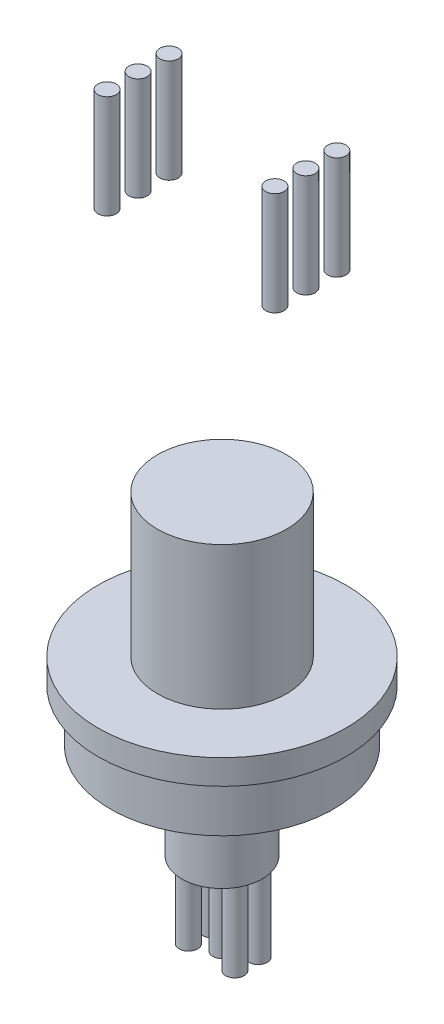
ISO-10303-21;
HEADER;
FILE_DESCRIPTION(('STEP AP214'),'2;1');
FILE_NAME('part.step','',(''),(''),'','','');
FILE_SCHEMA(('AUTOMOTIVE_DESIGN { 1 0 10303 214 1 1 1 1 }'));
ENDSEC;
DATA;
#1=APPLICATION_CONTEXT('core data for automotive mechanical design processes');
#2=APPLICATION_PROTOCOL_DEFINITION('international standard','automotive_design',2000,#1);
#3=PRODUCT_CONTEXT('',#1,'mechanical');
#4=PRODUCT('Part','Part','',(#3));
#5=PRODUCT_RELATED_PRODUCT_CATEGORY('part','',(#4));
#6=PRODUCT_DEFINITION_FORMATION('','',#4);
#7=PRODUCT_DEFINITION_CONTEXT('part definition',#1,'design');
#8=PRODUCT_DEFINITION('design','',#6,#7);
#9=PRODUCT_DEFINITION_SHAPE('','',#8);
#10=(LENGTH_UNIT() NAMED_UNIT(*) SI_UNIT(.MILLI.,.METRE.));
#11=(NAMED_UNIT(*) PLANE_ANGLE_UNIT() SI_UNIT($,.RADIAN.));
#12=(NAMED_UNIT(*) SI_UNIT($,.STERADIAN.) SOLID_ANGLE_UNIT());
#13=UNCERTAINTY_MEASURE_WITH_UNIT(LENGTH_MEASURE(1.E-05),#10,'distance_accuracy_value','');
#14=(GEOMETRIC_REPRESENTATION_CONTEXT(3) GLOBAL_UNCERTAINTY_ASSIGNED_CONTEXT((#13)) GLOBAL_UNIT_ASSIGNED_CONTEXT((#10,
#11,#12)) REPRESENTATION_CONTEXT('',''));
#15=CARTESIAN_POINT('',(0.,0.,0.));
#16=DIRECTION('',(0.,0.,1.));
#17=DIRECTION('',(1.,0.,0.));
#18=AXIS2_PLACEMENT_3D('',#15,#16,#17);
#19=CARTESIAN_POINT('',(0.,-13.8470129472589,0.));
#20=DIRECTION('',(0.,1.,0.));
#21=DIRECTION('',(0.,0.,1.));
#22=AXIS2_PLACEMENT_3D('',#19,#20,#21);
#23=CYLINDRICAL_SURFACE('',#22,6.25);
#24=CARTESIAN_POINT('',(0.,16.7,0.));
#25=DIRECTION('',(0.,1.,0.));
#26=DIRECTION('',(0.,0.,1.));
#27=AXIS2_PLACEMENT_3D('',#24,#25,#26);
#28=CIRCLE('',#27,6.25);
#29=CARTESIAN_POINT('',(0.,16.7,6.25));
#30=VERTEX_POINT('',#29);
#31=EDGE_CURVE('E12',#30,#30,#28,.F.);
#32=ORIENTED_EDGE('',*,*,#31,.F.);
#33=EDGE_LOOP('',(#32));
#34=FACE_BOUND('',#33,.T.);
#35=CARTESIAN_POINT('',(0.,30.5,0.));
#36=DIRECTION('',(0.,1.,0.));
#37=DIRECTION('',(0.,0.,1.));
#38=AXIS2_PLACEMENT_3D('',#35,#36,#37);
#39=CIRCLE('',#38,6.25);
#40=CARTESIAN_POINT('',(0.,30.5,6.25));
#41=VERTEX_POINT('',#40);
#42=EDGE_CURVE('E295',#41,#41,#39,.T.);
#43=ORIENTED_EDGE('',*,*,#42,.F.);
#44=EDGE_LOOP('',(#43));
#45=FACE_BOUND('',#44,.T.);
#46=ADVANCED_FACE('F71',(#34,#45),#23,.T.);
#47=CARTESIAN_POINT('',(0.,14.3,22.));
#48=DIRECTION('',(0.,-1.,0.));
#49=DIRECTION('',(0.,0.,-1.));
#50=AXIS2_PLACEMENT_3D('',#47,#48,#49);
#51=PLANE('',#50);
#52=CARTESIAN_POINT('',(0.,14.3,0.));
#53=DIRECTION('',(0.,1.,0.));
#54=DIRECTION('',(1.,0.,0.));
#55=AXIS2_PLACEMENT_3D('',#52,#53,#54);
#56=CIRCLE('',#55,10.8);
#57=CARTESIAN_POINT('',(0.,14.3,-10.8));
#58=VERTEX_POINT('',#57);
#59=EDGE_CURVE('E183',#58,#58,#56,.T.);
#60=ORIENTED_EDGE('',*,*,#59,.T.);
#61=EDGE_LOOP('',(#60));
#62=FACE_BOUND('',#61,.T.);
#63=CARTESIAN_POINT('',(0.,14.3,0.));
#64=DIRECTION('',(0.,-1.,0.));
#65=DIRECTION('',(0.,0.,-1.));
#66=AXIS2_PLACEMENT_3D('',#63,#64,#65);
#67=CIRCLE('',#66,12.);
#68=CARTESIAN_POINT('',(0.,14.3,-12.));
#69=VERTEX_POINT('',#68);
#70=EDGE_CURVE('E77',#69,#69,#67,.T.);
#71=ORIENTED_EDGE('',*,*,#70,.T.);
#72=EDGE_LOOP('',(#71));
#73=FACE_BOUND('',#72,.T.);
#74=ADVANCED_FACE('F298',(#62,#73),#51,.T.);
#75=CARTESIAN_POINT('',(0.,11.8,0.));
#76=DIRECTION('',(0.,1.,0.));
#77=DIRECTION('',(0.,0.,1.));
#78=AXIS2_PLACEMENT_3D('',#75,#76,#77);
#79=CYLINDRICAL_SURFACE('',#78,10.8);
#80=ORIENTED_EDGE('',*,*,#59,.F.);
#81=DIRECTION('',(0.,-1.,0.));
#82=VECTOR('',#81,1.);
#83=CARTESIAN_POINT('',(0.,11.8,-10.8));
#84=LINE('',#83,#82);
#85=CARTESIAN_POINT('',(0.,9.3,-10.8));
#86=VERTEX_POINT('',#85);
#87=EDGE_CURVE('E177',#58,#86,#84,.T.);
#88=ORIENTED_EDGE('',*,*,#87,.T.);
#89=CARTESIAN_POINT('',(0.,9.3,0.));
#90=DIRECTION('',(0.,1.,0.));
#91=DIRECTION('',(1.,0.,0.));
#92=AXIS2_PLACEMENT_3D('',#89,#90,#91);
#93=CIRCLE('',#92,10.8);
#94=EDGE_CURVE('E184',#86,#86,#93,.T.);
#95=ORIENTED_EDGE('',*,*,#94,.T.);
#96=ORIENTED_EDGE('',*,*,#87,.F.);
#97=EDGE_LOOP('',(#80,#88,#95,#96));
#98=FACE_BOUND('',#97,.T.);
#99=ADVANCED_FACE('F185',(#98),#79,.T.);
#100=CARTESIAN_POINT('',(0.,9.3,10.8));
#101=DIRECTION('',(0.,-1.,0.));
#102=DIRECTION('',(0.,0.,-1.));
#103=AXIS2_PLACEMENT_3D('',#100,#101,#102);
#104=PLANE('',#103);
#105=CARTESIAN_POINT('',(0.,9.3,0.));
#106=DIRECTION('',(0.,1.,0.));
#107=DIRECTION('',(1.,0.,0.));
#108=AXIS2_PLACEMENT_3D('',#105,#106,#107);
#109=CIRCLE('',#108,3.9);
#110=CARTESIAN_POINT('',(0.,9.3,-3.9));
#111=VERTEX_POINT('',#110);
#112=EDGE_CURVE('E193',#111,#111,#109,.T.);
#113=ORIENTED_EDGE('',*,*,#112,.T.);
#114=EDGE_LOOP('',(#113));
#115=FACE_BOUND('',#114,.T.);
#116=CARTESIAN_POINT('',(0.,9.3,0.));
#117=DIRECTION('',(0.,-1.,0.));
#118=DIRECTION('',(1.,0.,0.));
#119=AXIS2_PLACEMENT_3D('',#116,#117,#118);
#120=CIRCLE('',#119,8.);
#121=CARTESIAN_POINT('',(-8.,9.3,0.));
#122=VERTEX_POINT('',#121);
#123=EDGE_CURVE('E214',#122,#122,#120,.T.);
#124=ORIENTED_EDGE('',*,*,#123,.T.);
#125=EDGE_LOOP('',(#124));
#126=FACE_BOUND('',#125,.T.);
#127=ADVANCED_FACE('F332',(#115,#126),#104,.T.);
#128=CARTESIAN_POINT('',(0.,4.65,0.));
#129=DIRECTION('',(0.,1.,0.));
#130=DIRECTION('',(0.,0.,1.));
#131=AXIS2_PLACEMENT_3D('',#128,#129,#130);
#132=CYLINDRICAL_SURFACE('',#131,3.9);
#133=ORIENTED_EDGE('',*,*,#112,.F.);
#134=DIRECTION('',(0.,-1.,0.));
#135=VECTOR('',#134,1.);
#136=CARTESIAN_POINT('',(0.,4.65,-3.9));
#137=LINE('',#136,#135);
#138=CARTESIAN_POINT('',(0.,0.,-3.9));
#139=VERTEX_POINT('',#138);
#140=EDGE_CURVE('E211',#111,#139,#137,.T.);
#141=ORIENTED_EDGE('',*,*,#140,.T.);
#142=CARTESIAN_POINT('',(0.,0.,0.));
#143=DIRECTION('',(0.,1.,0.));
#144=DIRECTION('',(1.,0.,0.));
#145=AXIS2_PLACEMENT_3D('',#142,#143,#144);
#146=CIRCLE('',#145,3.9);
#147=EDGE_CURVE('E212',#139,#139,#146,.T.);
#148=ORIENTED_EDGE('',*,*,#147,.T.);
#149=ORIENTED_EDGE('',*,*,#140,.F.);
#150=EDGE_LOOP('',(#133,#141,#148,#149));
#151=FACE_BOUND('',#150,.T.);
#152=ADVANCED_FACE('F334',(#151),#132,.T.);
#153=CARTESIAN_POINT('',(0.,0.,3.9));
#154=DIRECTION('',(0.,-1.,0.));
#155=DIRECTION('',(0.,0.,-1.));
#156=AXIS2_PLACEMENT_3D('',#153,#154,#155);
#157=PLANE('',#156);
#158=CARTESIAN_POINT('',(0.,0.,0.));
#159=DIRECTION('',(0.,1.,0.));
#160=DIRECTION('',(1.,0.,0.));
#161=AXIS2_PLACEMENT_3D('',#158,#159,#160);
#162=CIRCLE('',#161,0.89);
#163=CARTESIAN_POINT('',(-0.89,0.,0.));
#164=VERTEX_POINT('',#163);
#165=EDGE_CURVE('E261',#164,#164,#162,.T.);
#166=ORIENTED_EDGE('',*,*,#165,.T.);
#167=EDGE_LOOP('',(#166));
#168=FACE_BOUND('',#167,.T.);
#169=CARTESIAN_POINT('',(-2.25,0.,1.));
#170=DIRECTION('',(0.,1.,0.));
#171=DIRECTION('',(1.,0.,0.));
#172=AXIS2_PLACEMENT_3D('',#169,#170,#171);
#173=CIRCLE('',#172,0.89);
#174=CARTESIAN_POINT('',(-3.14,0.,1.));
#175=VERTEX_POINT('',#174);
#176=EDGE_CURVE('E252',#175,#175,#173,.T.);
#177=ORIENTED_EDGE('',*,*,#176,.T.);
#178=EDGE_LOOP('',(#177));
#179=FACE_BOUND('',#178,.T.);
#180=CARTESIAN_POINT('',(2.25,0.,-1.24999998509884));
#181=DIRECTION('',(0.,1.,0.));
#182=DIRECTION('',(1.,0.,0.));
#183=AXIS2_PLACEMENT_3D('',#180,#181,#182);
#184=CIRCLE('',#183,0.89);
#185=CARTESIAN_POINT('',(1.36,0.,-1.24999998509884));
#186=VERTEX_POINT('',#185);
#187=EDGE_CURVE('E237',#186,#186,#184,.T.);
#188=ORIENTED_EDGE('',*,*,#187,.T.);
#189=EDGE_LOOP('',(#188));
#190=FACE_BOUND('',#189,.T.);
#191=CARTESIAN_POINT('',(0.,0.,-2.25));
#192=DIRECTION('',(0.,1.,0.));
#193=DIRECTION('',(1.,0.,0.));
#194=AXIS2_PLACEMENT_3D('',#191,#192,#193);
#195=CIRCLE('',#194,0.89);
#196=CARTESIAN_POINT('',(-0.89,0.,-2.25));
#197=VERTEX_POINT('',#196);
#198=EDGE_CURVE('E226',#197,#197,#195,.T.);
#199=ORIENTED_EDGE('',*,*,#198,.T.);
#200=EDGE_LOOP('',(#199));
#201=FACE_BOUND('',#200,.T.);
#202=CARTESIAN_POINT('',(-2.25,0.,-1.24999998509884));
#203=DIRECTION('',(0.,1.,0.));
#204=DIRECTION('',(1.,0.,0.));
#205=AXIS2_PLACEMENT_3D('',#202,#203,#204);
#206=CIRCLE('',#205,0.89);
#207=CARTESIAN_POINT('',(-3.14,0.,-1.24999998509884));
#208=VERTEX_POINT('',#207);
#209=EDGE_CURVE('E121',#208,#208,#206,.T.);
#210=ORIENTED_EDGE('',*,*,#209,.T.);
#211=EDGE_LOOP('',(#210));
#212=FACE_BOUND('',#211,.T.);
#213=CARTESIAN_POINT('',(2.25,0.,1.));
#214=DIRECTION('',(0.,1.,0.));
#215=DIRECTION('',(1.,0.,0.));
#216=AXIS2_PLACEMENT_3D('',#213,#214,#215);
#217=CIRCLE('',#216,0.89);
#218=CARTESIAN_POINT('',(1.36,0.,1.));
#219=VERTEX_POINT('',#218);
#220=EDGE_CURVE('E113',#219,#219,#217,.T.);
#221=ORIENTED_EDGE('',*,*,#220,.T.);
#222=EDGE_LOOP('',(#221));
#223=FACE_BOUND('',#222,.T.);
#224=ORIENTED_EDGE('',*,*,#147,.F.);
#225=EDGE_LOOP('',(#224));
#226=FACE_BOUND('',#225,.T.);
#227=ADVANCED_FACE('F337',(#168,#179,#190,#201,#212,#223,#226),#157,.T.);
#228=CARTESIAN_POINT('',(0.,9.3,10.8));
#229=DIRECTION('',(0.,-1.,0.));
#230=DIRECTION('',(0.,0.,-1.));
#231=AXIS2_PLACEMENT_3D('',#228,#229,#230);
#232=PLANE('',#231);
#233=CARTESIAN_POINT('',(0.,9.3,0.));
#234=DIRECTION('',(0.,1.,0.));
#235=DIRECTION('',(1.,0.,0.));
#236=AXIS2_PLACEMENT_3D('',#233,#234,#235);
#237=CIRCLE('',#236,10.);
#238=CARTESIAN_POINT('',(-10.,9.3,0.));
#239=VERTEX_POINT('',#238);
#240=EDGE_CURVE('E224',#239,#239,#237,.T.);
#241=ORIENTED_EDGE('',*,*,#240,.T.);
#242=EDGE_LOOP('',(#241));
#243=FACE_BOUND('',#242,.T.);
#244=ORIENTED_EDGE('',*,*,#94,.F.);
#245=EDGE_LOOP('',(#244));
#246=FACE_BOUND('',#245,.T.);
#247=ADVANCED_FACE('F336',(#243,#246),#232,.T.);
#248=CARTESIAN_POINT('',(0.,11.3,0.));
#249=DIRECTION('',(0.,-1.,0.));
#250=DIRECTION('',(0.,0.,-1.));
#251=AXIS2_PLACEMENT_3D('',#248,#249,#250);
#252=PLANE('',#251);
#253=CARTESIAN_POINT('',(0.,11.3,0.));
#254=DIRECTION('',(0.,-1.,0.));
#255=DIRECTION('',(1.,0.,0.));
#256=AXIS2_PLACEMENT_3D('',#253,#254,#255);
#257=CIRCLE('',#256,8.);
#258=CARTESIAN_POINT('',(-8.,11.3,0.));
#259=VERTEX_POINT('',#258);
#260=EDGE_CURVE('E264',#259,#259,#257,.T.);
#261=ORIENTED_EDGE('',*,*,#260,.F.);
#262=EDGE_LOOP('',(#261));
#263=FACE_BOUND('',#262,.T.);
#264=CARTESIAN_POINT('',(0.,11.3,0.));
#265=DIRECTION('',(0.,1.,0.));
#266=DIRECTION('',(1.,0.,0.));
#267=AXIS2_PLACEMENT_3D('',#264,#265,#266);
#268=CIRCLE('',#267,10.);
#269=CARTESIAN_POINT('',(-10.,11.3,0.));
#270=VERTEX_POINT('',#269);
#271=EDGE_CURVE('E240',#270,#270,#268,.T.);
#272=ORIENTED_EDGE('',*,*,#271,.F.);
#273=EDGE_LOOP('',(#272));
#274=FACE_BOUND('',#273,.T.);
#275=ADVANCED_FACE('F347',(#263,#274),#252,.T.);
#276=CARTESIAN_POINT('',(0.,9.3,0.));
#277=DIRECTION('',(0.,1.,0.));
#278=DIRECTION('',(1.,0.,0.));
#279=AXIS2_PLACEMENT_3D('',#276,#277,#278);
#280=CYLINDRICAL_SURFACE('',#279,10.);
#281=ORIENTED_EDGE('',*,*,#240,.F.);
#282=DIRECTION('',(0.,1.,0.));
#283=VECTOR('',#282,1.);
#284=CARTESIAN_POINT('',(-10.,9.3,0.));
#285=LINE('',#284,#283);
#286=EDGE_CURVE('E242',#239,#270,#285,.T.);
#287=ORIENTED_EDGE('',*,*,#286,.T.);
#288=ORIENTED_EDGE('',*,*,#271,.T.);
#289=ORIENTED_EDGE('',*,*,#286,.F.);
#290=EDGE_LOOP('',(#281,#287,#288,#289));
#291=FACE_BOUND('',#290,.T.);
#292=ADVANCED_FACE('F348',(#291),#280,.F.);
#293=CARTESIAN_POINT('',(0.,9.3,0.));
#294=DIRECTION('',(0.,1.,0.));
#295=DIRECTION('',(1.,0.,0.));
#296=AXIS2_PLACEMENT_3D('',#293,#294,#295);
#297=CYLINDRICAL_SURFACE('',#296,8.);
#298=ORIENTED_EDGE('',*,*,#123,.F.);
#299=DIRECTION('',(0.,1.,0.));
#300=VECTOR('',#299,1.);
#301=CARTESIAN_POINT('',(-8.,9.3,0.));
#302=LINE('',#301,#300);
#303=EDGE_CURVE('E238',#122,#259,#302,.T.);
#304=ORIENTED_EDGE('',*,*,#303,.T.);
#305=ORIENTED_EDGE('',*,*,#260,.T.);
#306=ORIENTED_EDGE('',*,*,#303,.F.);
#307=EDGE_LOOP('',(#298,#304,#305,#306));
#308=FACE_BOUND('',#307,.T.);
#309=ADVANCED_FACE('F351',(#308),#297,.T.);
#310=CARTESIAN_POINT('',(0.,-8.,0.));
#311=DIRECTION('',(0.,-1.,0.));
#312=DIRECTION('',(0.,0.,-1.));
#313=AXIS2_PLACEMENT_3D('',#310,#311,#312);
#314=PLANE('',#313);
#315=CARTESIAN_POINT('',(0.,-8.,0.));
#316=DIRECTION('',(0.,-1.,0.));
#317=DIRECTION('',(1.,0.,0.));
#318=AXIS2_PLACEMENT_3D('',#315,#316,#317);
#319=CIRCLE('',#318,0.89);
#320=CARTESIAN_POINT('',(-0.89,-8.,0.));
#321=VERTEX_POINT('',#320);
#322=EDGE_CURVE('E209',#321,#321,#319,.T.);
#323=ORIENTED_EDGE('',*,*,#322,.T.);
#324=EDGE_LOOP('',(#323));
#325=FACE_BOUND('',#324,.T.);
#326=ADVANCED_FACE('F357',(#325),#314,.T.);
#327=CARTESIAN_POINT('',(0.,0.,0.));
#328=DIRECTION('',(0.,-1.,0.));
#329=DIRECTION('',(1.,0.,0.));
#330=AXIS2_PLACEMENT_3D('',#327,#328,#329);
#331=CYLINDRICAL_SURFACE('',#330,0.89);
#332=ORIENTED_EDGE('',*,*,#322,.F.);
#333=DIRECTION('',(0.,1.,0.));
#334=VECTOR('',#333,1.);
#335=CARTESIAN_POINT('',(-0.89,0.,0.));
#336=LINE('',#335,#334);
#337=EDGE_CURVE('E202',#321,#164,#336,.T.);
#338=ORIENTED_EDGE('',*,*,#337,.T.);
#339=ORIENTED_EDGE('',*,*,#165,.F.);
#340=ORIENTED_EDGE('',*,*,#337,.F.);
#341=EDGE_LOOP('',(#332,#338,#339,#340));
#342=FACE_BOUND('',#341,.T.);
#343=ADVANCED_FACE('F356',(#342),#331,.T.);
#344=CARTESIAN_POINT('',(-2.25,-8.,1.));
#345=DIRECTION('',(0.,-1.,0.));
#346=DIRECTION('',(0.,0.,-1.));
#347=AXIS2_PLACEMENT_3D('',#344,#345,#346);
#348=PLANE('',#347);
#349=CARTESIAN_POINT('',(-2.25,-8.,1.));
#350=DIRECTION('',(0.,-1.,0.));
#351=DIRECTION('',(1.,0.,0.));
#352=AXIS2_PLACEMENT_3D('',#349,#350,#351);
#353=CIRCLE('',#352,0.89);
#354=CARTESIAN_POINT('',(-3.14,-8.,1.));
#355=VERTEX_POINT('',#354);
#356=EDGE_CURVE('E207',#355,#355,#353,.T.);
#357=ORIENTED_EDGE('',*,*,#356,.T.);
#358=EDGE_LOOP('',(#357));
#359=FACE_BOUND('',#358,.T.);
#360=ADVANCED_FACE('F361',(#359),#348,.T.);
#361=CARTESIAN_POINT('',(-2.25,0.,1.));
#362=DIRECTION('',(0.,-1.,0.));
#363=DIRECTION('',(1.,0.,0.));
#364=AXIS2_PLACEMENT_3D('',#361,#362,#363);
#365=CYLINDRICAL_SURFACE('',#364,0.89);
#366=ORIENTED_EDGE('',*,*,#356,.F.);
#367=DIRECTION('',(0.,1.,0.));
#368=VECTOR('',#367,1.);
#369=CARTESIAN_POINT('',(-3.14,0.,1.));
#370=LINE('',#369,#368);
#371=EDGE_CURVE('E250',#355,#175,#370,.T.);
#372=ORIENTED_EDGE('',*,*,#371,.T.);
#373=ORIENTED_EDGE('',*,*,#176,.F.);
#374=ORIENTED_EDGE('',*,*,#371,.F.);
#375=EDGE_LOOP('',(#366,#372,#373,#374));
#376=FACE_BOUND('',#375,.T.);
#377=ADVANCED_FACE('F370',(#376),#365,.T.);
#378=CARTESIAN_POINT('',(2.25,-8.,-1.24999998509884));
#379=DIRECTION('',(0.,-1.,0.));
#380=DIRECTION('',(0.,0.,-1.));
#381=AXIS2_PLACEMENT_3D('',#378,#379,#380);
#382=PLANE('',#381);
#383=CARTESIAN_POINT('',(2.25,-8.,-1.24999998509884));
#384=DIRECTION('',(0.,-1.,0.));
#385=DIRECTION('',(1.,0.,0.));
#386=AXIS2_PLACEMENT_3D('',#383,#384,#385);
#387=CIRCLE('',#386,0.89);
#388=CARTESIAN_POINT('',(1.36,-8.,-1.24999998509884));
#389=VERTEX_POINT('',#388);
#390=EDGE_CURVE('E243',#389,#389,#387,.T.);
#391=ORIENTED_EDGE('',*,*,#390,.T.);
#392=EDGE_LOOP('',(#391));
#393=FACE_BOUND('',#392,.T.);
#394=ADVANCED_FACE('F369',(#393),#382,.T.);
#395=CARTESIAN_POINT('',(2.25,0.,-1.24999998509884));
#396=DIRECTION('',(0.,-1.,0.));
#397=DIRECTION('',(1.,0.,0.));
#398=AXIS2_PLACEMENT_3D('',#395,#396,#397);
#399=CYLINDRICAL_SURFACE('',#398,0.89);
#400=ORIENTED_EDGE('',*,*,#390,.F.);
#401=DIRECTION('',(0.,1.,0.));
#402=VECTOR('',#401,1.);
#403=CARTESIAN_POINT('',(1.36,0.,-1.24999998509884));
#404=LINE('',#403,#402);
#405=EDGE_CURVE('E232',#389,#186,#404,.T.);
#406=ORIENTED_EDGE('',*,*,#405,.T.);
#407=ORIENTED_EDGE('',*,*,#187,.F.);
#408=ORIENTED_EDGE('',*,*,#405,.F.);
#409=EDGE_LOOP('',(#400,#406,#407,#408));
#410=FACE_BOUND('',#409,.T.);
#411=ADVANCED_FACE('F375',(#410),#399,.T.);
#412=CARTESIAN_POINT('',(0.,-8.,-2.25));
#413=DIRECTION('',(0.,-1.,0.));
#414=DIRECTION('',(0.,0.,-1.));
#415=AXIS2_PLACEMENT_3D('',#412,#413,#414);
#416=PLANE('',#415);
#417=CARTESIAN_POINT('',(0.,-8.,-2.25));
#418=DIRECTION('',(0.,-1.,0.));
#419=DIRECTION('',(1.,0.,0.));
#420=AXIS2_PLACEMENT_3D('',#417,#418,#419);
#421=CIRCLE('',#420,0.89);
#422=CARTESIAN_POINT('',(-0.89,-8.,-2.25));
#423=VERTEX_POINT('',#422);
#424=EDGE_CURVE('E199',#423,#423,#421,.T.);
#425=ORIENTED_EDGE('',*,*,#424,.T.);
#426=EDGE_LOOP('',(#425));
#427=FACE_BOUND('',#426,.T.);
#428=ADVANCED_FACE('F376',(#427),#416,.T.);
#429=CARTESIAN_POINT('',(0.,0.,-2.25));
#430=DIRECTION('',(0.,-1.,0.));
#431=DIRECTION('',(1.,0.,0.));
#432=AXIS2_PLACEMENT_3D('',#429,#430,#431);
#433=CYLINDRICAL_SURFACE('',#432,0.89);
#434=ORIENTED_EDGE('',*,*,#424,.F.);
#435=DIRECTION('',(0.,1.,0.));
#436=VECTOR('',#435,1.);
#437=CARTESIAN_POINT('',(-0.89,0.,-2.25));
#438=LINE('',#437,#436);
#439=EDGE_CURVE('E191',#423,#197,#438,.T.);
#440=ORIENTED_EDGE('',*,*,#439,.T.);
#441=ORIENTED_EDGE('',*,*,#198,.F.);
#442=ORIENTED_EDGE('',*,*,#439,.F.);
#443=EDGE_LOOP('',(#434,#440,#441,#442));
#444=FACE_BOUND('',#443,.T.);
#445=ADVANCED_FACE('F379',(#444),#433,.T.);
#446=CARTESIAN_POINT('',(-2.25,-8.,-1.24999998509884));
#447=DIRECTION('',(0.,-1.,0.));
#448=DIRECTION('',(0.,0.,-1.));
#449=AXIS2_PLACEMENT_3D('',#446,#447,#448);
#450=PLANE('',#449);
#451=CARTESIAN_POINT('',(-2.25,-8.,-1.24999998509884));
#452=DIRECTION('',(0.,-1.,0.));
#453=DIRECTION('',(1.,0.,0.));
#454=AXIS2_PLACEMENT_3D('',#451,#452,#453);
#455=CIRCLE('',#454,0.89);
#456=CARTESIAN_POINT('',(-3.14,-8.,-1.24999998509884));
#457=VERTEX_POINT('',#456);
#458=EDGE_CURVE('E200',#457,#457,#455,.T.);
#459=ORIENTED_EDGE('',*,*,#458,.T.);
#460=EDGE_LOOP('',(#459));
#461=FACE_BOUND('',#460,.T.);
#462=ADVANCED_FACE('F383',(#461),#450,.T.);
#463=CARTESIAN_POINT('',(-2.25,0.,-1.24999998509884));
#464=DIRECTION('',(0.,-1.,0.));
#465=DIRECTION('',(1.,0.,0.));
#466=AXIS2_PLACEMENT_3D('',#463,#464,#465);
#467=CYLINDRICAL_SURFACE('',#466,0.89);
#468=ORIENTED_EDGE('',*,*,#458,.F.);
#469=DIRECTION('',(0.,1.,0.));
#470=VECTOR('',#469,1.);
#471=CARTESIAN_POINT('',(-3.14,0.,-1.24999998509884));
#472=LINE('',#471,#470);
#473=EDGE_CURVE('E204',#457,#208,#472,.T.);
#474=ORIENTED_EDGE('',*,*,#473,.T.);
#475=ORIENTED_EDGE('',*,*,#209,.F.);
#476=ORIENTED_EDGE('',*,*,#473,.F.);
#477=EDGE_LOOP('',(#468,#474,#475,#476));
#478=FACE_BOUND('',#477,.T.);
#479=ADVANCED_FACE('F390',(#478),#467,.T.);
#480=CARTESIAN_POINT('',(2.25,-8.,1.));
#481=DIRECTION('',(0.,-1.,0.));
#482=DIRECTION('',(0.,0.,-1.));
#483=AXIS2_PLACEMENT_3D('',#480,#481,#482);
#484=PLANE('',#483);
#485=CARTESIAN_POINT('',(2.25,-8.,1.));
#486=DIRECTION('',(0.,-1.,0.));
#487=DIRECTION('',(1.,0.,0.));
#488=AXIS2_PLACEMENT_3D('',#485,#486,#487);
#489=CIRCLE('',#488,0.89);
#490=CARTESIAN_POINT('',(1.36,-8.,1.));
#491=VERTEX_POINT('',#490);
#492=EDGE_CURVE('E216',#491,#491,#489,.T.);
#493=ORIENTED_EDGE('',*,*,#492,.T.);
#494=EDGE_LOOP('',(#493));
#495=FACE_BOUND('',#494,.T.);
#496=ADVANCED_FACE('F322',(#495),#484,.T.);
#497=CARTESIAN_POINT('',(2.25,0.,1.));
#498=DIRECTION('',(0.,-1.,0.));
#499=DIRECTION('',(1.,0.,0.));
#500=AXIS2_PLACEMENT_3D('',#497,#498,#499);
#501=CYLINDRICAL_SURFACE('',#500,0.89);
#502=ORIENTED_EDGE('',*,*,#492,.F.);
#503=DIRECTION('',(0.,1.,0.));
#504=VECTOR('',#503,1.);
#505=CARTESIAN_POINT('',(1.36,0.,1.));
#506=LINE('',#505,#504);
#507=EDGE_CURVE('E82',#491,#219,#506,.T.);
#508=ORIENTED_EDGE('',*,*,#507,.T.);
#509=ORIENTED_EDGE('',*,*,#220,.F.);
#510=ORIENTED_EDGE('',*,*,#507,.F.);
#511=EDGE_LOOP('',(#502,#508,#509,#510));
#512=FACE_BOUND('',#511,.T.);
#513=ADVANCED_FACE('F318',(#512),#501,.T.);
#514=CARTESIAN_POINT('',(0.,-8.,0.));
#515=DIRECTION('',(0.,1.,0.));
#516=DIRECTION('',(0.,0.,1.));
#517=AXIS2_PLACEMENT_3D('',#514,#515,#516);
#518=CYLINDRICAL_SURFACE('',#517,12.);
#519=ORIENTED_EDGE('',*,*,#70,.F.);
#520=EDGE_LOOP('',(#519));
#521=FACE_BOUND('',#520,.T.);
#522=CARTESIAN_POINT('',(0.,16.7,0.));
#523=DIRECTION('',(0.,1.,0.));
#524=DIRECTION('',(0.,0.,1.));
#525=AXIS2_PLACEMENT_3D('',#522,#523,#524);
#526=CIRCLE('',#525,12.);
#527=CARTESIAN_POINT('',(0.,16.7,12.));
#528=VERTEX_POINT('',#527);
#529=EDGE_CURVE('E287',#528,#528,#526,.T.);
#530=ORIENTED_EDGE('',*,*,#529,.F.);
#531=EDGE_LOOP('',(#530));
#532=FACE_BOUND('',#531,.T.);
#533=ADVANCED_FACE('F311',(#521,#532),#518,.T.);
#534=CARTESIAN_POINT('',(0.,16.7,10.8));
#535=DIRECTION('',(0.,1.,0.));
#536=DIRECTION('',(1.,0.,0.));
#537=AXIS2_PLACEMENT_3D('',#534,#535,#536);
#538=PLANE('',#537);
#539=ORIENTED_EDGE('',*,*,#31,.T.);
#540=EDGE_LOOP('',(#539));
#541=FACE_BOUND('',#540,.T.);
#542=ORIENTED_EDGE('',*,*,#529,.T.);
#543=EDGE_LOOP('',(#542));
#544=FACE_BOUND('',#543,.T.);
#545=ADVANCED_FACE('F313',(#541,#544),#538,.T.);
#546=CARTESIAN_POINT('',(0.,30.5,0.));
#547=DIRECTION('',(0.,1.,0.));
#548=DIRECTION('',(0.,0.,1.));
#549=AXIS2_PLACEMENT_3D('',#546,#547,#548);
#550=PLANE('',#549);
#551=ORIENTED_EDGE('',*,*,#42,.T.);
#552=EDGE_LOOP('',(#551));
#553=FACE_BOUND('',#552,.T.);
#554=ADVANCED_FACE('F300',(#553),#550,.T.);
#555=CLOSED_SHELL('',(#46,#74,#99,#127,#152,#227,#247,#275,#292,#309,#326,#343,#360,#377,#394,
#411,#428,#445,#462,#479,#496,#513,#533,#545,#554));
#556=MANIFOLD_SOLID_BREP('B2',#555);
#557=CARTESIAN_POINT('',(-8.125,61.7,-3.));
#558=DIRECTION('',(0.,1.,0.));
#559=DIRECTION('',(1.,0.,0.));
#560=AXIS2_PLACEMENT_3D('',#557,#558,#559);
#561=PLANE('',#560);
#562=CARTESIAN_POINT('',(-8.125,61.7,-3.));
#563=DIRECTION('',(0.,1.,0.));
#564=DIRECTION('',(-1.,0.,0.));
#565=AXIS2_PLACEMENT_3D('',#562,#563,#564);
#566=CIRCLE('',#565,0.89);
#567=CARTESIAN_POINT('',(-7.235,61.7,-3.));
#568=VERTEX_POINT('',#567);
#569=EDGE_CURVE('E848',#568,#568,#566,.T.);
#570=ORIENTED_EDGE('',*,*,#569,.T.);
#571=EDGE_LOOP('',(#570));
#572=FACE_BOUND('',#571,.T.);
#573=ADVANCED_FACE('F827',(#572),#561,.T.);
#574=CARTESIAN_POINT('',(-8.125,51.7,-3.));
#575=DIRECTION('',(0.,1.,0.));
#576=DIRECTION('',(-1.,0.,0.));
#577=AXIS2_PLACEMENT_3D('',#574,#575,#576);
#578=CYLINDRICAL_SURFACE('',#577,0.89);
#579=ORIENTED_EDGE('',*,*,#569,.F.);
#580=DIRECTION('',(0.,-1.,0.));
#581=VECTOR('',#580,1.);
#582=CARTESIAN_POINT('',(-7.235,51.7,-3.));
#583=LINE('',#582,#581);
#584=CARTESIAN_POINT('',(-7.235,51.7,-3.));
#585=VERTEX_POINT('',#584);
#586=EDGE_CURVE('E838',#568,#585,#583,.T.);
#587=ORIENTED_EDGE('',*,*,#586,.T.);
#588=CARTESIAN_POINT('',(-8.125,51.7,-3.));
#589=DIRECTION('',(0.,1.,0.));
#590=DIRECTION('',(0.,0.,1.));
#591=AXIS2_PLACEMENT_3D('',#588,#589,#590);
#592=CIRCLE('',#591,0.89);
#593=EDGE_CURVE('E72',#585,#585,#592,.F.);
#594=ORIENTED_EDGE('',*,*,#593,.F.);
#595=ORIENTED_EDGE('',*,*,#586,.F.);
#596=EDGE_LOOP('',(#579,#587,#594,#595));
#597=FACE_BOUND('',#596,.T.);
#598=ADVANCED_FACE('F846',(#597),#578,.T.);
#599=CARTESIAN_POINT('',(0.,51.7,0.));
#600=DIRECTION('',(0.,1.,0.));
#601=DIRECTION('',(0.,0.,1.));
#602=AXIS2_PLACEMENT_3D('',#599,#600,#601);
#603=PLANE('',#602);
#604=ORIENTED_EDGE('',*,*,#593,.T.);
#605=EDGE_LOOP('',(#604));
#606=FACE_BOUND('',#605,.T.);
#607=ADVANCED_FACE('F829',(#606),#603,.F.);
#608=CLOSED_SHELL('',(#573,#598,#607));
#609=MANIFOLD_SOLID_BREP('B6',#608);
#610=CARTESIAN_POINT('',(8.125,61.7,0.));
#611=DIRECTION('',(0.,1.,0.));
#612=DIRECTION('',(1.,0.,0.));
#613=AXIS2_PLACEMENT_3D('',#610,#611,#612);
#614=PLANE('',#613);
#615=CARTESIAN_POINT('',(8.125,61.7,0.));
#616=DIRECTION('',(0.,1.,0.));
#617=DIRECTION('',(-1.,0.,0.));
#618=AXIS2_PLACEMENT_3D('',#615,#616,#617);
#619=CIRCLE('',#618,0.89);
#620=CARTESIAN_POINT('',(9.015,61.7,0.));
#621=VERTEX_POINT('',#620);
#622=EDGE_CURVE('E953',#621,#621,#619,.T.);
#623=ORIENTED_EDGE('',*,*,#622,.T.);
#624=EDGE_LOOP('',(#623));
#625=FACE_BOUND('',#624,.T.);
#626=ADVANCED_FACE('F931',(#625),#614,.T.);
#627=CARTESIAN_POINT('',(8.125,51.7,0.));
#628=DIRECTION('',(0.,1.,0.));
#629=DIRECTION('',(-1.,0.,0.));
#630=AXIS2_PLACEMENT_3D('',#627,#628,#629);
#631=CYLINDRICAL_SURFACE('',#630,0.89);
#632=ORIENTED_EDGE('',*,*,#622,.F.);
#633=DIRECTION('',(0.,-1.,0.));
#634=VECTOR('',#633,1.);
#635=CARTESIAN_POINT('',(9.015,51.7,0.));
#636=LINE('',#635,#634);
#637=CARTESIAN_POINT('',(9.015,51.7,0.));
#638=VERTEX_POINT('',#637);
#639=EDGE_CURVE('E942',#621,#638,#636,.T.);
#640=ORIENTED_EDGE('',*,*,#639,.T.);
#641=CARTESIAN_POINT('',(8.125,51.7,0.));
#642=DIRECTION('',(0.,1.,0.));
#643=DIRECTION('',(0.,0.,1.));
#644=AXIS2_PLACEMENT_3D('',#641,#642,#643);
#645=CIRCLE('',#644,0.89);
#646=EDGE_CURVE('E823',#638,#638,#645,.F.);
#647=ORIENTED_EDGE('',*,*,#646,.F.);
#648=ORIENTED_EDGE('',*,*,#639,.F.);
#649=EDGE_LOOP('',(#632,#640,#647,#648));
#650=FACE_BOUND('',#649,.T.);
#651=ADVANCED_FACE('F954',(#650),#631,.T.);
#652=CARTESIAN_POINT('',(0.,51.7,0.));
#653=DIRECTION('',(0.,1.,0.));
#654=DIRECTION('',(0.,0.,1.));
#655=AXIS2_PLACEMENT_3D('',#652,#653,#654);
#656=PLANE('',#655);
#657=ORIENTED_EDGE('',*,*,#646,.T.);
#658=EDGE_LOOP('',(#657));
#659=FACE_BOUND('',#658,.T.);
#660=ADVANCED_FACE('F932',(#659),#656,.F.);
#661=CLOSED_SHELL('',(#626,#651,#660));
#662=MANIFOLD_SOLID_BREP('B63',#661);
#663=CARTESIAN_POINT('',(8.125,61.7,-3.));
#664=DIRECTION('',(0.,1.,0.));
#665=DIRECTION('',(1.,0.,0.));
#666=AXIS2_PLACEMENT_3D('',#663,#664,#665);
#667=PLANE('',#666);
#668=CARTESIAN_POINT('',(8.125,61.7,-3.));
#669=DIRECTION('',(0.,1.,0.));
#670=DIRECTION('',(-1.,0.,0.));
#671=AXIS2_PLACEMENT_3D('',#668,#669,#670);
#672=CIRCLE('',#671,0.89);
#673=CARTESIAN_POINT('',(9.015,61.7,-3.));
#674=VERTEX_POINT('',#673);
#675=EDGE_CURVE('E1056',#674,#674,#672,.T.);
#676=ORIENTED_EDGE('',*,*,#675,.T.);
#677=EDGE_LOOP('',(#676));
#678=FACE_BOUND('',#677,.T.);
#679=ADVANCED_FACE('F1036',(#678),#667,.T.);
#680=CARTESIAN_POINT('',(8.125,51.7,-3.));
#681=DIRECTION('',(0.,1.,0.));
#682=DIRECTION('',(-1.,0.,0.));
#683=AXIS2_PLACEMENT_3D('',#680,#681,#682);
#684=CYLINDRICAL_SURFACE('',#683,0.89);
#685=ORIENTED_EDGE('',*,*,#675,.F.);
#686=DIRECTION('',(0.,-1.,0.));
#687=VECTOR('',#686,1.);
#688=CARTESIAN_POINT('',(9.015,51.7,-3.));
#689=LINE('',#688,#687);
#690=CARTESIAN_POINT('',(9.015,51.7,-3.));
#691=VERTEX_POINT('',#690);
#692=EDGE_CURVE('E1047',#674,#691,#689,.T.);
#693=ORIENTED_EDGE('',*,*,#692,.T.);
#694=CARTESIAN_POINT('',(8.125,51.7,-3.));
#695=DIRECTION('',(0.,1.,0.));
#696=DIRECTION('',(0.,0.,1.));
#697=AXIS2_PLACEMENT_3D('',#694,#695,#696);
#698=CIRCLE('',#697,0.89);
#699=EDGE_CURVE('E927',#691,#691,#698,.F.);
#700=ORIENTED_EDGE('',*,*,#699,.F.);
#701=ORIENTED_EDGE('',*,*,#692,.F.);
#702=EDGE_LOOP('',(#685,#693,#700,#701));
#703=FACE_BOUND('',#702,.T.);
#704=ADVANCED_FACE('F1060',(#703),#684,.T.);
#705=CARTESIAN_POINT('',(0.,51.7,0.));
#706=DIRECTION('',(0.,1.,0.));
#707=DIRECTION('',(0.,0.,1.));
#708=AXIS2_PLACEMENT_3D('',#705,#706,#707);
#709=PLANE('',#708);
#710=ORIENTED_EDGE('',*,*,#699,.T.);
#711=EDGE_LOOP('',(#710));
#712=FACE_BOUND('',#711,.T.);
#713=ADVANCED_FACE('F1038',(#712),#709,.F.);
#714=CLOSED_SHELL('',(#679,#704,#713));
#715=MANIFOLD_SOLID_BREP('B818',#714);
#716=CARTESIAN_POINT('',(-8.125,61.7,0.));
#717=DIRECTION('',(0.,1.,0.));
#718=DIRECTION('',(1.,0.,0.));
#719=AXIS2_PLACEMENT_3D('',#716,#717,#718);
#720=PLANE('',#719);
#721=CARTESIAN_POINT('',(-8.125,61.7,0.));
#722=DIRECTION('',(0.,1.,0.));
#723=DIRECTION('',(-1.,0.,0.));
#724=AXIS2_PLACEMENT_3D('',#721,#722,#723);
#725=CIRCLE('',#724,0.89);
#726=CARTESIAN_POINT('',(-7.235,61.7,0.));
#727=VERTEX_POINT('',#726);
#728=EDGE_CURVE('E1163',#727,#727,#725,.T.);
#729=ORIENTED_EDGE('',*,*,#728,.T.);
#730=EDGE_LOOP('',(#729));
#731=FACE_BOUND('',#730,.T.);
#732=ADVANCED_FACE('F1141',(#731),#720,.T.);
#733=CARTESIAN_POINT('',(-8.125,51.7,0.));
#734=DIRECTION('',(0.,1.,0.));
#735=DIRECTION('',(-1.,0.,0.));
#736=AXIS2_PLACEMENT_3D('',#733,#734,#735);
#737=CYLINDRICAL_SURFACE('',#736,0.89);
#738=ORIENTED_EDGE('',*,*,#728,.F.);
#739=DIRECTION('',(0.,-1.,0.));
#740=VECTOR('',#739,1.);
#741=CARTESIAN_POINT('',(-7.235,51.7,0.));
#742=LINE('',#741,#740);
#743=CARTESIAN_POINT('',(-7.235,51.7,0.));
#744=VERTEX_POINT('',#743);
#745=EDGE_CURVE('E1151',#727,#744,#742,.T.);
#746=ORIENTED_EDGE('',*,*,#745,.T.);
#747=CARTESIAN_POINT('',(-8.125,51.7,0.));
#748=DIRECTION('',(0.,1.,0.));
#749=DIRECTION('',(0.,0.,1.));
#750=AXIS2_PLACEMENT_3D('',#747,#748,#749);
#751=CIRCLE('',#750,0.89);
#752=EDGE_CURVE('E1032',#744,#744,#751,.F.);
#753=ORIENTED_EDGE('',*,*,#752,.F.);
#754=ORIENTED_EDGE('',*,*,#745,.F.);
#755=EDGE_LOOP('',(#738,#746,#753,#754));
#756=FACE_BOUND('',#755,.T.);
#757=ADVANCED_FACE('F1161',(#756),#737,.T.);
#758=CARTESIAN_POINT('',(0.,51.7,0.));
#759=DIRECTION('',(0.,1.,0.));
#760=DIRECTION('',(0.,0.,1.));
#761=AXIS2_PLACEMENT_3D('',#758,#759,#760);
#762=PLANE('',#761);
#763=ORIENTED_EDGE('',*,*,#752,.T.);
#764=EDGE_LOOP('',(#763));
#765=FACE_BOUND('',#764,.T.);
#766=ADVANCED_FACE('F1143',(#765),#762,.F.);
#767=CLOSED_SHELL('',(#732,#757,#766));
#768=MANIFOLD_SOLID_BREP('B923',#767);
#769=CARTESIAN_POINT('',(8.125,61.7,3.));
#770=DIRECTION('',(0.,1.,0.));
#771=DIRECTION('',(1.,0.,0.));
#772=AXIS2_PLACEMENT_3D('',#769,#770,#771);
#773=PLANE('',#772);
#774=CARTESIAN_POINT('',(8.125,61.7,3.));
#775=DIRECTION('',(0.,1.,0.));
#776=DIRECTION('',(-1.,0.,0.));
#777=AXIS2_PLACEMENT_3D('',#774,#775,#776);
#778=CIRCLE('',#777,0.89);
#779=CARTESIAN_POINT('',(9.015,61.7,3.));
#780=VERTEX_POINT('',#779);
#781=EDGE_CURVE('E1266',#780,#780,#778,.T.);
#782=ORIENTED_EDGE('',*,*,#781,.T.);
#783=EDGE_LOOP('',(#782));
#784=FACE_BOUND('',#783,.T.);
#785=ADVANCED_FACE('F1244',(#784),#773,.T.);
#786=CARTESIAN_POINT('',(8.125,51.7,3.));
#787=DIRECTION('',(0.,1.,0.));
#788=DIRECTION('',(-1.,0.,0.));
#789=AXIS2_PLACEMENT_3D('',#786,#787,#788);
#790=CYLINDRICAL_SURFACE('',#789,0.89);
#791=ORIENTED_EDGE('',*,*,#781,.F.);
#792=DIRECTION('',(0.,-1.,0.));
#793=VECTOR('',#792,1.);
#794=CARTESIAN_POINT('',(9.015,51.7,3.));
#795=LINE('',#794,#793);
#796=CARTESIAN_POINT('',(9.015,51.7,3.));
#797=VERTEX_POINT('',#796);
#798=EDGE_CURVE('E1254',#780,#797,#795,.T.);
#799=ORIENTED_EDGE('',*,*,#798,.T.);
#800=CARTESIAN_POINT('',(8.125,51.7,3.));
#801=DIRECTION('',(0.,1.,0.));
#802=DIRECTION('',(0.,0.,1.));
#803=AXIS2_PLACEMENT_3D('',#800,#801,#802);
#804=CIRCLE('',#803,0.89);
#805=EDGE_CURVE('E1139',#797,#797,#804,.F.);
#806=ORIENTED_EDGE('',*,*,#805,.F.);
#807=ORIENTED_EDGE('',*,*,#798,.F.);
#808=EDGE_LOOP('',(#791,#799,#806,#807));
#809=FACE_BOUND('',#808,.T.);
#810=ADVANCED_FACE('F1269',(#809),#790,.T.);
#811=CARTESIAN_POINT('',(0.,51.7,0.));
#812=DIRECTION('',(0.,1.,0.));
#813=DIRECTION('',(0.,0.,1.));
#814=AXIS2_PLACEMENT_3D('',#811,#812,#813);
#815=PLANE('',#814);
#816=ORIENTED_EDGE('',*,*,#805,.T.);
#817=EDGE_LOOP('',(#816));
#818=FACE_BOUND('',#817,.T.);
#819=ADVANCED_FACE('F1250',(#818),#815,.F.);
#820=CLOSED_SHELL('',(#785,#810,#819));
#821=MANIFOLD_SOLID_BREP('B1026',#820);
#822=CARTESIAN_POINT('',(-8.125,61.7,3.));
#823=DIRECTION('',(0.,1.,0.));
#824=DIRECTION('',(1.,0.,0.));
#825=AXIS2_PLACEMENT_3D('',#822,#823,#824);
#826=PLANE('',#825);
#827=CARTESIAN_POINT('',(-8.125,61.7,3.));
#828=DIRECTION('',(0.,1.,0.));
#829=DIRECTION('',(-1.,0.,0.));
#830=AXIS2_PLACEMENT_3D('',#827,#828,#829);
#831=CIRCLE('',#830,0.89);
#832=CARTESIAN_POINT('',(-7.235,61.7,3.));
#833=VERTEX_POINT('',#832);
#834=EDGE_CURVE('E1347',#833,#833,#831,.T.);
#835=ORIENTED_EDGE('',*,*,#834,.T.);
#836=EDGE_LOOP('',(#835));
#837=FACE_BOUND('',#836,.T.);
#838=ADVANCED_FACE('F1338',(#837),#826,.T.);
#839=CARTESIAN_POINT('',(-8.125,51.7,3.));
#840=DIRECTION('',(0.,1.,0.));
#841=DIRECTION('',(-1.,0.,0.));
#842=AXIS2_PLACEMENT_3D('',#839,#840,#841);
#843=CYLINDRICAL_SURFACE('',#842,0.89);
#844=ORIENTED_EDGE('',*,*,#834,.F.);
#845=DIRECTION('',(0.,-1.,0.));
#846=VECTOR('',#845,1.);
#847=CARTESIAN_POINT('',(-7.235,51.7,3.));
#848=LINE('',#847,#846);
#849=CARTESIAN_POINT('',(-7.235,51.7,3.));
#850=VERTEX_POINT('',#849);
#851=EDGE_CURVE('E1241',#833,#850,#848,.T.);
#852=ORIENTED_EDGE('',*,*,#851,.T.);
#853=CARTESIAN_POINT('',(-8.125,51.7,3.));
#854=DIRECTION('',(0.,1.,0.));
#855=DIRECTION('',(0.,0.,1.));
#856=AXIS2_PLACEMENT_3D('',#853,#854,#855);
#857=CIRCLE('',#856,0.89);
#858=EDGE_CURVE('E1360',#850,#850,#857,.F.);
#859=ORIENTED_EDGE('',*,*,#858,.F.);
#860=ORIENTED_EDGE('',*,*,#851,.F.);
#861=EDGE_LOOP('',(#844,#852,#859,#860));
#862=FACE_BOUND('',#861,.T.);
#863=ADVANCED_FACE('F1362',(#862),#843,.T.);
#864=CARTESIAN_POINT('',(0.,51.7,0.));
#865=DIRECTION('',(0.,1.,0.));
#866=DIRECTION('',(0.,0.,1.));
#867=AXIS2_PLACEMENT_3D('',#864,#865,#866);
#868=PLANE('',#867);
#869=ORIENTED_EDGE('',*,*,#858,.T.);
#870=EDGE_LOOP('',(#869));
#871=FACE_BOUND('',#870,.T.);
#872=ADVANCED_FACE('F1413',(#871),#868,.F.);
#873=CLOSED_SHELL('',(#838,#863,#872));
#874=MANIFOLD_SOLID_BREP('B1131',#873);
#875=ADVANCED_BREP_SHAPE_REPRESENTATION('',(#18,#556,#609,#662,#715,#768,#821,#874),#14);
#876=SHAPE_DEFINITION_REPRESENTATION(#9,#875);
ENDSEC;
END-ISO-10303-21;
